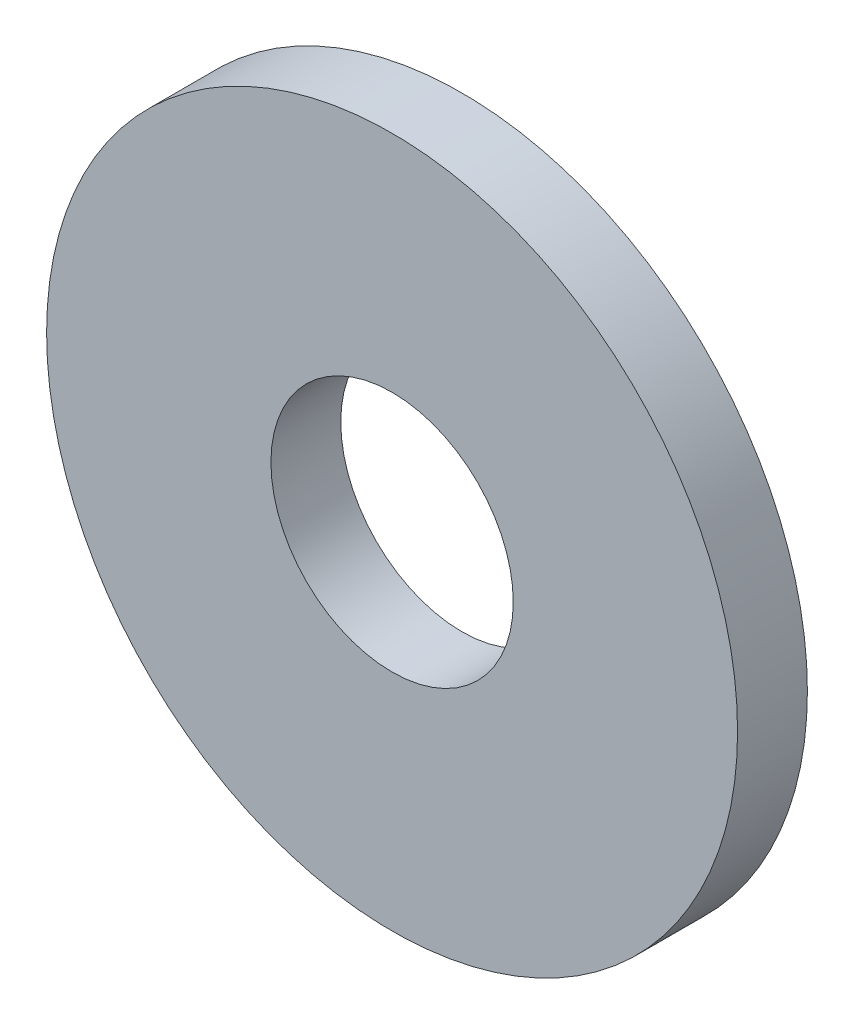
ISO-10303-21;
HEADER;
FILE_DESCRIPTION(('STEP AP214'),'2;1');
FILE_NAME('part.step','',(''),(''),'','','');
FILE_SCHEMA(('AUTOMOTIVE_DESIGN { 1 0 10303 214 1 1 1 1 }'));
ENDSEC;
DATA;
#1=APPLICATION_CONTEXT('core data for automotive mechanical design processes');
#2=APPLICATION_PROTOCOL_DEFINITION('international standard','automotive_design',2000,#1);
#3=PRODUCT_CONTEXT('',#1,'mechanical');
#4=PRODUCT('Part','Part','',(#3));
#5=PRODUCT_RELATED_PRODUCT_CATEGORY('part','',(#4));
#6=PRODUCT_DEFINITION_FORMATION('','',#4);
#7=PRODUCT_DEFINITION_CONTEXT('part definition',#1,'design');
#8=PRODUCT_DEFINITION('design','',#6,#7);
#9=PRODUCT_DEFINITION_SHAPE('','',#8);
#10=(LENGTH_UNIT() NAMED_UNIT(*) SI_UNIT(.MILLI.,.METRE.));
#11=(NAMED_UNIT(*) PLANE_ANGLE_UNIT() SI_UNIT($,.RADIAN.));
#12=(NAMED_UNIT(*) SI_UNIT($,.STERADIAN.) SOLID_ANGLE_UNIT());
#13=UNCERTAINTY_MEASURE_WITH_UNIT(LENGTH_MEASURE(1.E-05),#10,'distance_accuracy_value','');
#14=(GEOMETRIC_REPRESENTATION_CONTEXT(3) GLOBAL_UNCERTAINTY_ASSIGNED_CONTEXT((#13)) GLOBAL_UNIT_ASSIGNED_CONTEXT((#10,
#11,#12)) REPRESENTATION_CONTEXT('',''));
#15=CARTESIAN_POINT('',(0.,0.,0.));
#16=DIRECTION('',(0.,0.,1.));
#17=DIRECTION('',(1.,0.,0.));
#18=AXIS2_PLACEMENT_3D('',#15,#16,#17);
#19=CARTESIAN_POINT('',(0.,0.,1.7));
#20=DIRECTION('',(0.,0.,1.));
#21=DIRECTION('',(1.,0.,0.));
#22=AXIS2_PLACEMENT_3D('',#19,#20,#21);
#23=PLANE('',#22);
#24=CARTESIAN_POINT('',(0.,0.,1.7));
#25=DIRECTION('',(0.,0.,1.));
#26=DIRECTION('',(1.,0.,0.));
#27=AXIS2_PLACEMENT_3D('',#24,#25,#26);
#28=CIRCLE('',#27,8.41197243913529);
#29=CARTESIAN_POINT('',(8.41197243913529,0.,1.7));
#30=VERTEX_POINT('',#29);
#31=EDGE_CURVE('E10',#30,#30,#28,.T.);
#32=ORIENTED_EDGE('',*,*,#31,.T.);
#33=EDGE_LOOP('',(#32));
#34=FACE_BOUND('',#33,.T.);
#35=CARTESIAN_POINT('',(0.,0.,1.7));
#36=DIRECTION('',(0.,0.,1.));
#37=DIRECTION('',(1.,0.,0.));
#38=AXIS2_PLACEMENT_3D('',#35,#36,#37);
#39=CIRCLE('',#38,2.95);
#40=CARTESIAN_POINT('',(2.95,0.,1.7));
#41=VERTEX_POINT('',#40);
#42=EDGE_CURVE('E42',#41,#41,#39,.T.);
#43=ORIENTED_EDGE('',*,*,#42,.F.);
#44=EDGE_LOOP('',(#43));
#45=FACE_BOUND('',#44,.T.);
#46=ADVANCED_FACE('F31',(#34,#45),#23,.T.);
#47=CARTESIAN_POINT('',(0.,0.,0.));
#48=DIRECTION('',(0.,0.,1.));
#49=DIRECTION('',(1.,0.,0.));
#50=AXIS2_PLACEMENT_3D('',#47,#48,#49);
#51=PLANE('',#50);
#52=CARTESIAN_POINT('',(0.,0.,0.));
#53=DIRECTION('',(0.,0.,1.));
#54=DIRECTION('',(1.,0.,0.));
#55=AXIS2_PLACEMENT_3D('',#52,#53,#54);
#56=CIRCLE('',#55,8.41197243913529);
#57=CARTESIAN_POINT('',(8.41197243913529,0.,0.));
#58=VERTEX_POINT('',#57);
#59=EDGE_CURVE('E35',#58,#58,#56,.T.);
#60=ORIENTED_EDGE('',*,*,#59,.F.);
#61=EDGE_LOOP('',(#60));
#62=FACE_BOUND('',#61,.T.);
#63=CARTESIAN_POINT('',(0.,0.,0.));
#64=DIRECTION('',(0.,0.,1.));
#65=DIRECTION('',(1.,0.,0.));
#66=AXIS2_PLACEMENT_3D('',#63,#64,#65);
#67=CIRCLE('',#66,2.95);
#68=CARTESIAN_POINT('',(2.95,0.,0.));
#69=VERTEX_POINT('',#68);
#70=EDGE_CURVE('E44',#69,#69,#67,.T.);
#71=ORIENTED_EDGE('',*,*,#70,.T.);
#72=EDGE_LOOP('',(#71));
#73=FACE_BOUND('',#72,.T.);
#74=ADVANCED_FACE('F54',(#62,#73),#51,.F.);
#75=CARTESIAN_POINT('',(0.,0.,1.7));
#76=DIRECTION('',(0.,0.,-1.));
#77=DIRECTION('',(-1.,0.,0.));
#78=AXIS2_PLACEMENT_3D('',#75,#76,#77);
#79=CYLINDRICAL_SURFACE('',#78,8.41197243913529);
#80=ORIENTED_EDGE('',*,*,#31,.F.);
#81=EDGE_LOOP('',(#80));
#82=FACE_BOUND('',#81,.T.);
#83=ORIENTED_EDGE('',*,*,#59,.T.);
#84=EDGE_LOOP('',(#83));
#85=FACE_BOUND('',#84,.T.);
#86=ADVANCED_FACE('F33',(#82,#85),#79,.T.);
#87=CARTESIAN_POINT('',(0.,0.,1.7));
#88=DIRECTION('',(0.,0.,-1.));
#89=DIRECTION('',(-1.,0.,0.));
#90=AXIS2_PLACEMENT_3D('',#87,#88,#89);
#91=CYLINDRICAL_SURFACE('',#90,2.95);
#92=ORIENTED_EDGE('',*,*,#42,.T.);
#93=EDGE_LOOP('',(#92));
#94=FACE_BOUND('',#93,.T.);
#95=ORIENTED_EDGE('',*,*,#70,.F.);
#96=EDGE_LOOP('',(#95));
#97=FACE_BOUND('',#96,.T.);
#98=ADVANCED_FACE('F50',(#94,#97),#91,.F.);
#99=CLOSED_SHELL('',(#46,#74,#86,#98));
#100=MANIFOLD_SOLID_BREP('B2',#99);
#101=ADVANCED_BREP_SHAPE_REPRESENTATION('',(#18,#100),#14);
#102=SHAPE_DEFINITION_REPRESENTATION(#9,#101);
ENDSEC;
END-ISO-10303-21;
